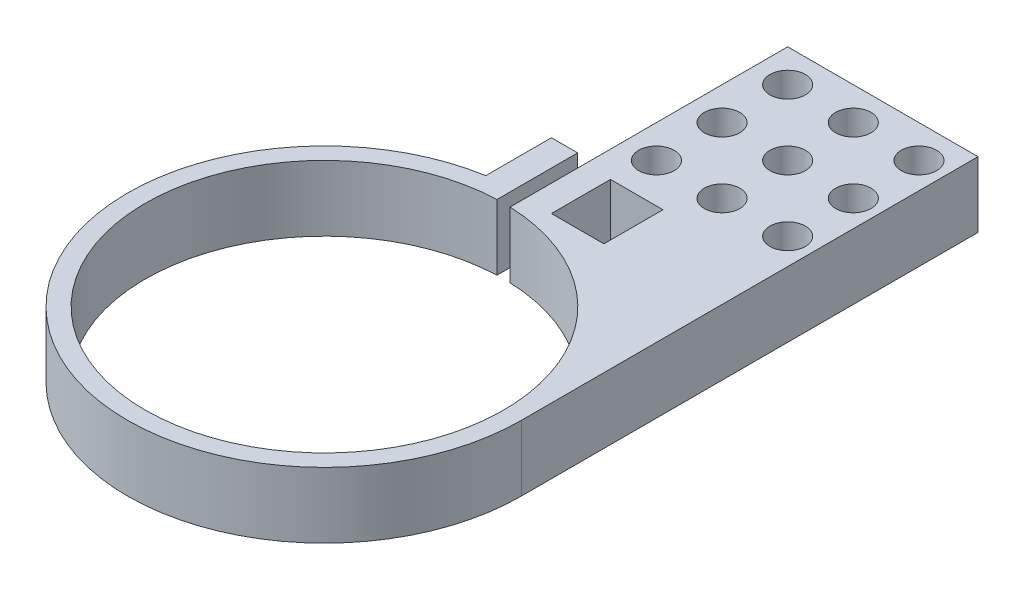
ISO-10303-21;
HEADER;
FILE_DESCRIPTION(('STEP AP214'),'2;1');
FILE_NAME('part.step','',(''),(''),'','','');
FILE_SCHEMA(('AUTOMOTIVE_DESIGN { 1 0 10303 214 1 1 1 1 }'));
ENDSEC;
DATA;
#1=APPLICATION_CONTEXT('core data for automotive mechanical design processes');
#2=APPLICATION_PROTOCOL_DEFINITION('international standard','automotive_design',2000,#1);
#3=PRODUCT_CONTEXT('',#1,'mechanical');
#4=PRODUCT('Part','Part','',(#3));
#5=PRODUCT_RELATED_PRODUCT_CATEGORY('part','',(#4));
#6=PRODUCT_DEFINITION_FORMATION('','',#4);
#7=PRODUCT_DEFINITION_CONTEXT('part definition',#1,'design');
#8=PRODUCT_DEFINITION('design','',#6,#7);
#9=PRODUCT_DEFINITION_SHAPE('','',#8);
#10=(LENGTH_UNIT() NAMED_UNIT(*) SI_UNIT(.MILLI.,.METRE.));
#11=(NAMED_UNIT(*) PLANE_ANGLE_UNIT() SI_UNIT($,.RADIAN.));
#12=(NAMED_UNIT(*) SI_UNIT($,.STERADIAN.) SOLID_ANGLE_UNIT());
#13=UNCERTAINTY_MEASURE_WITH_UNIT(LENGTH_MEASURE(1.E-05),#10,'distance_accuracy_value','');
#14=(GEOMETRIC_REPRESENTATION_CONTEXT(3) GLOBAL_UNCERTAINTY_ASSIGNED_CONTEXT((#13)) GLOBAL_UNIT_ASSIGNED_CONTEXT((#10,
#11,#12)) REPRESENTATION_CONTEXT('',''));
#15=CARTESIAN_POINT('',(0.,0.,0.));
#16=DIRECTION('',(0.,0.,1.));
#17=DIRECTION('',(1.,0.,0.));
#18=AXIS2_PLACEMENT_3D('',#15,#16,#17);
#19=CARTESIAN_POINT('',(0.,12.7,0.));
#20=DIRECTION('',(0.,-1.,0.));
#21=DIRECTION('',(0.,0.,-1.));
#22=AXIS2_PLACEMENT_3D('',#19,#20,#21);
#23=CYLINDRICAL_SURFACE('',#22,38.1);
#24=DIRECTION('',(0.,-1.,0.));
#25=VECTOR('',#24,1.);
#26=CARTESIAN_POINT('',(38.1,12.7,0.));
#27=LINE('',#26,#25);
#28=CARTESIAN_POINT('',(38.1,12.7,0.));
#29=VERTEX_POINT('',#28);
#30=CARTESIAN_POINT('',(38.1,0.,0.));
#31=VERTEX_POINT('',#30);
#32=EDGE_CURVE('E150',#29,#31,#27,.T.);
#33=ORIENTED_EDGE('',*,*,#32,.F.);
#34=CARTESIAN_POINT('',(0.,12.7,0.));
#35=DIRECTION('',(0.,1.,0.));
#36=DIRECTION('',(0.,0.,1.));
#37=AXIS2_PLACEMENT_3D('',#34,#35,#36);
#38=CIRCLE('',#37,38.1);
#39=CARTESIAN_POINT('',(-6.35000000000001,12.7,-37.5671066226826));
#40=VERTEX_POINT('',#39);
#41=EDGE_CURVE('E45',#40,#29,#38,.T.);
#42=ORIENTED_EDGE('',*,*,#41,.F.);
#43=DIRECTION('',(0.,-1.,0.));
#44=VECTOR('',#43,1.);
#45=CARTESIAN_POINT('',(-6.35,12.7,-37.5671066226826));
#46=LINE('',#45,#44);
#47=CARTESIAN_POINT('',(-6.35,0.,-37.5671066226826));
#48=VERTEX_POINT('',#47);
#49=EDGE_CURVE('E197',#40,#48,#46,.T.);
#50=ORIENTED_EDGE('',*,*,#49,.T.);
#51=CARTESIAN_POINT('',(0.,0.,0.));
#52=DIRECTION('',(0.,1.,0.));
#53=DIRECTION('',(0.,0.,1.));
#54=AXIS2_PLACEMENT_3D('',#51,#52,#53);
#55=CIRCLE('',#54,38.1);
#56=EDGE_CURVE('E184',#48,#31,#55,.T.);
#57=ORIENTED_EDGE('',*,*,#56,.T.);
#58=EDGE_LOOP('',(#33,#42,#50,#57));
#59=FACE_BOUND('',#58,.T.);
#60=ADVANCED_FACE('F38',(#59),#23,.T.);
#61=CARTESIAN_POINT('',(0.,12.7,0.));
#62=DIRECTION('',(0.,1.,0.));
#63=DIRECTION('',(0.,0.,1.));
#64=AXIS2_PLACEMENT_3D('',#61,#62,#63);
#65=PLANE('',#64);
#66=DIRECTION('',(1.,0.,0.));
#67=VECTOR('',#66,1.);
#68=CARTESIAN_POINT('',(1.27,12.7,-88.3671066226826));
#69=LINE('',#68,#67);
#70=CARTESIAN_POINT('',(1.27,12.7,-88.3671066226826));
#71=VERTEX_POINT('',#70);
#72=CARTESIAN_POINT('',(38.1,12.7,-88.3671066226826));
#73=VERTEX_POINT('',#72);
#74=EDGE_CURVE('E52',#71,#73,#69,.T.);
#75=ORIENTED_EDGE('',*,*,#74,.F.);
#76=DIRECTION('',(0.,0.,-1.));
#77=VECTOR('',#76,1.);
#78=CARTESIAN_POINT('',(1.27,12.7,-1.43164468337886));
#79=LINE('',#78,#77);
#80=CARTESIAN_POINT('',(1.27,12.7,-34.6477321191445));
#81=VERTEX_POINT('',#80);
#82=EDGE_CURVE('E139',#81,#71,#79,.T.);
#83=ORIENTED_EDGE('',*,*,#82,.F.);
#84=CARTESIAN_POINT('',(0.,12.7,0.));
#85=DIRECTION('',(0.,1.,0.));
#86=DIRECTION('',(0.,0.,1.));
#87=AXIS2_PLACEMENT_3D('',#84,#85,#86);
#88=CIRCLE('',#87,34.671);
#89=CARTESIAN_POINT('',(-1.27,12.7,-34.6477321191445));
#90=VERTEX_POINT('',#89);
#91=EDGE_CURVE('E187',#90,#81,#88,.T.);
#92=ORIENTED_EDGE('',*,*,#91,.F.);
#93=DIRECTION('',(0.,0.,1.));
#94=VECTOR('',#93,1.);
#95=CARTESIAN_POINT('',(-1.27,12.7,-1.43164468337886));
#96=LINE('',#95,#94);
#97=CARTESIAN_POINT('',(-1.27,12.7,-50.2671066226826));
#98=VERTEX_POINT('',#97);
#99=EDGE_CURVE('E153',#98,#90,#96,.T.);
#100=ORIENTED_EDGE('',*,*,#99,.F.);
#101=DIRECTION('',(-1.,0.,0.));
#102=VECTOR('',#101,1.);
#103=CARTESIAN_POINT('',(6.35,12.7,-50.2671066226826));
#104=LINE('',#103,#102);
#105=CARTESIAN_POINT('',(-6.35,12.7,-50.2671066226826));
#106=VERTEX_POINT('',#105);
#107=EDGE_CURVE('E168',#98,#106,#104,.T.);
#108=ORIENTED_EDGE('',*,*,#107,.T.);
#109=DIRECTION('',(0.,0.,1.));
#110=VECTOR('',#109,1.);
#111=CARTESIAN_POINT('',(-6.35,12.7,-50.2671066226826));
#112=LINE('',#111,#110);
#113=EDGE_CURVE('E163',#106,#40,#112,.T.);
#114=ORIENTED_EDGE('',*,*,#113,.T.);
#115=ORIENTED_EDGE('',*,*,#41,.T.);
#116=DIRECTION('',(0.,0.,1.));
#117=VECTOR('',#116,1.);
#118=CARTESIAN_POINT('',(38.1,12.7,-50.2671066226826));
#119=LINE('',#118,#117);
#120=EDGE_CURVE('E207',#73,#29,#119,.T.);
#121=ORIENTED_EDGE('',*,*,#120,.F.);
#122=EDGE_LOOP('',(#75,#83,#92,#100,#108,#114,#115,#121));
#123=FACE_BOUND('',#122,.T.);
#124=CARTESIAN_POINT('',(33.0200000000004,12.7,-56.6171066226826));
#125=DIRECTION('',(0.,1.,0.));
#126=DIRECTION('',(0.,0.,1.));
#127=AXIS2_PLACEMENT_3D('',#124,#125,#126);
#128=CIRCLE('',#127,3.42900000000001);
#129=CARTESIAN_POINT('',(33.0200000000004,12.7,-53.1881066226826));
#130=VERTEX_POINT('',#129);
#131=EDGE_CURVE('E215',#130,#130,#128,.T.);
#132=ORIENTED_EDGE('',*,*,#131,.F.);
#133=EDGE_LOOP('',(#132));
#134=FACE_BOUND('',#133,.T.);
#135=CARTESIAN_POINT('',(33.0200000000003,12.7,-69.3171066226826));
#136=DIRECTION('',(0.,1.,0.));
#137=DIRECTION('',(0.,0.,1.));
#138=AXIS2_PLACEMENT_3D('',#135,#136,#137);
#139=CIRCLE('',#138,3.42900000000001);
#140=CARTESIAN_POINT('',(33.0200000000003,12.7,-65.8881066226826));
#141=VERTEX_POINT('',#140);
#142=EDGE_CURVE('E226',#141,#141,#139,.T.);
#143=ORIENTED_EDGE('',*,*,#142,.F.);
#144=EDGE_LOOP('',(#143));
#145=FACE_BOUND('',#144,.T.);
#146=CARTESIAN_POINT('',(33.0200000000001,12.7,-82.0171066226826));
#147=DIRECTION('',(0.,1.,0.));
#148=DIRECTION('',(0.,0.,1.));
#149=AXIS2_PLACEMENT_3D('',#146,#147,#148);
#150=CIRCLE('',#149,3.42900000000001);
#151=CARTESIAN_POINT('',(33.0200000000001,12.7,-78.5881066226825));
#152=VERTEX_POINT('',#151);
#153=EDGE_CURVE('E233',#152,#152,#150,.T.);
#154=ORIENTED_EDGE('',*,*,#153,.F.);
#155=EDGE_LOOP('',(#154));
#156=FACE_BOUND('',#155,.T.);
#157=CARTESIAN_POINT('',(7.62000000000013,12.7,-82.0171066226826));
#158=DIRECTION('',(0.,1.,0.));
#159=DIRECTION('',(0.,0.,1.));
#160=AXIS2_PLACEMENT_3D('',#157,#158,#159);
#161=CIRCLE('',#160,3.42900000000001);
#162=CARTESIAN_POINT('',(7.62000000000013,12.7,-78.5881066226826));
#163=VERTEX_POINT('',#162);
#164=EDGE_CURVE('E322',#163,#163,#161,.T.);
#165=ORIENTED_EDGE('',*,*,#164,.F.);
#166=EDGE_LOOP('',(#165));
#167=FACE_BOUND('',#166,.T.);
#168=CARTESIAN_POINT('',(20.3200000000001,12.7,-82.0171066226826));
#169=DIRECTION('',(0.,1.,0.));
#170=DIRECTION('',(0.,0.,1.));
#171=AXIS2_PLACEMENT_3D('',#168,#169,#170);
#172=CIRCLE('',#171,3.42900000000001);
#173=CARTESIAN_POINT('',(20.3200000000001,12.7,-78.5881066226825));
#174=VERTEX_POINT('',#173);
#175=EDGE_CURVE('E261',#174,#174,#172,.T.);
#176=ORIENTED_EDGE('',*,*,#175,.F.);
#177=EDGE_LOOP('',(#176));
#178=FACE_BOUND('',#177,.T.);
#179=DIRECTION('',(1.,0.,0.));
#180=VECTOR('',#179,1.);
#181=CARTESIAN_POINT('',(6.35,12.7,-37.5671066226826));
#182=LINE('',#181,#180);
#183=CARTESIAN_POINT('',(6.35,12.7,-37.5671066226826));
#184=VERTEX_POINT('',#183);
#185=CARTESIAN_POINT('',(16.51,12.7,-37.5671066226826));
#186=VERTEX_POINT('',#185);
#187=EDGE_CURVE('E315',#184,#186,#182,.T.);
#188=ORIENTED_EDGE('',*,*,#187,.F.);
#189=DIRECTION('',(0.,0.,1.));
#190=VECTOR('',#189,1.);
#191=CARTESIAN_POINT('',(6.35,12.7,-48.9971066226826));
#192=LINE('',#191,#190);
#193=CARTESIAN_POINT('',(6.35,12.7,-48.9971066226826));
#194=VERTEX_POINT('',#193);
#195=EDGE_CURVE('E251',#194,#184,#192,.T.);
#196=ORIENTED_EDGE('',*,*,#195,.F.);
#197=DIRECTION('',(-1.,0.,0.));
#198=VECTOR('',#197,1.);
#199=CARTESIAN_POINT('',(6.35,12.7,-48.9971066226826));
#200=LINE('',#199,#198);
#201=CARTESIAN_POINT('',(16.51,12.7,-48.9971066226826));
#202=VERTEX_POINT('',#201);
#203=EDGE_CURVE('E247',#202,#194,#200,.T.);
#204=ORIENTED_EDGE('',*,*,#203,.F.);
#205=DIRECTION('',(0.,0.,-1.));
#206=VECTOR('',#205,1.);
#207=CARTESIAN_POINT('',(16.51,12.7,-48.9971066226826));
#208=LINE('',#207,#206);
#209=EDGE_CURVE('E265',#186,#202,#208,.T.);
#210=ORIENTED_EDGE('',*,*,#209,.F.);
#211=EDGE_LOOP('',(#188,#196,#204,#210));
#212=FACE_BOUND('',#211,.T.);
#213=CARTESIAN_POINT('',(7.62000000000027,12.7,-69.3171066226826));
#214=DIRECTION('',(0.,1.,0.));
#215=DIRECTION('',(0.,0.,1.));
#216=AXIS2_PLACEMENT_3D('',#213,#214,#215);
#217=CIRCLE('',#216,3.42900000000001);
#218=CARTESIAN_POINT('',(7.62000000000027,12.7,-65.8881066226825));
#219=VERTEX_POINT('',#218);
#220=EDGE_CURVE('E277',#219,#219,#217,.T.);
#221=ORIENTED_EDGE('',*,*,#220,.F.);
#222=EDGE_LOOP('',(#221));
#223=FACE_BOUND('',#222,.T.);
#224=CARTESIAN_POINT('',(20.3200000000003,12.7,-69.3171066226826));
#225=DIRECTION('',(0.,1.,0.));
#226=DIRECTION('',(0.,0.,1.));
#227=AXIS2_PLACEMENT_3D('',#224,#225,#226);
#228=CIRCLE('',#227,3.42900000000001);
#229=CARTESIAN_POINT('',(20.3200000000003,12.7,-65.8881066226825));
#230=VERTEX_POINT('',#229);
#231=EDGE_CURVE('E286',#230,#230,#228,.T.);
#232=ORIENTED_EDGE('',*,*,#231,.F.);
#233=EDGE_LOOP('',(#232));
#234=FACE_BOUND('',#233,.T.);
#235=CARTESIAN_POINT('',(7.6200000000004,12.7,-56.6171066226826));
#236=DIRECTION('',(0.,1.,0.));
#237=DIRECTION('',(0.,0.,1.));
#238=AXIS2_PLACEMENT_3D('',#235,#236,#237);
#239=CIRCLE('',#238,3.42900000000001);
#240=CARTESIAN_POINT('',(7.6200000000004,12.7,-53.1881066226826));
#241=VERTEX_POINT('',#240);
#242=EDGE_CURVE('E294',#241,#241,#239,.T.);
#243=ORIENTED_EDGE('',*,*,#242,.F.);
#244=EDGE_LOOP('',(#243));
#245=FACE_BOUND('',#244,.T.);
#246=CARTESIAN_POINT('',(20.3200000000004,12.7,-56.6171066226826));
#247=DIRECTION('',(0.,1.,0.));
#248=DIRECTION('',(0.,0.,1.));
#249=AXIS2_PLACEMENT_3D('',#246,#247,#248);
#250=CIRCLE('',#249,3.42900000000002);
#251=CARTESIAN_POINT('',(20.3200000000004,12.7,-53.1881066226826));
#252=VERTEX_POINT('',#251);
#253=EDGE_CURVE('E301',#252,#252,#250,.T.);
#254=ORIENTED_EDGE('',*,*,#253,.F.);
#255=EDGE_LOOP('',(#254));
#256=FACE_BOUND('',#255,.T.);
#257=ADVANCED_FACE('F349',(#123,#134,#145,#156,#167,#178,#212,#223,#234,#245,#256),#65,.T.);
#258=CARTESIAN_POINT('',(0.,0.,0.));
#259=DIRECTION('',(0.,1.,0.));
#260=DIRECTION('',(0.,0.,1.));
#261=AXIS2_PLACEMENT_3D('',#258,#259,#260);
#262=PLANE('',#261);
#263=CARTESIAN_POINT('',(33.0200000000004,0.,-56.6171066226826));
#264=DIRECTION('',(0.,1.,0.));
#265=DIRECTION('',(0.,0.,1.));
#266=AXIS2_PLACEMENT_3D('',#263,#264,#265);
#267=CIRCLE('',#266,3.42900000000001);
#268=CARTESIAN_POINT('',(33.0200000000004,0.,-53.1881066226826));
#269=VERTEX_POINT('',#268);
#270=EDGE_CURVE('E212',#269,#269,#267,.T.);
#271=ORIENTED_EDGE('',*,*,#270,.T.);
#272=EDGE_LOOP('',(#271));
#273=FACE_BOUND('',#272,.T.);
#274=CARTESIAN_POINT('',(33.0200000000003,0.,-69.3171066226826));
#275=DIRECTION('',(0.,1.,0.));
#276=DIRECTION('',(0.,0.,1.));
#277=AXIS2_PLACEMENT_3D('',#274,#275,#276);
#278=CIRCLE('',#277,3.42900000000001);
#279=CARTESIAN_POINT('',(33.0200000000003,0.,-65.8881066226826));
#280=VERTEX_POINT('',#279);
#281=EDGE_CURVE('E220',#280,#280,#278,.T.);
#282=ORIENTED_EDGE('',*,*,#281,.T.);
#283=EDGE_LOOP('',(#282));
#284=FACE_BOUND('',#283,.T.);
#285=CARTESIAN_POINT('',(33.0200000000001,0.,-82.0171066226826));
#286=DIRECTION('',(0.,1.,0.));
#287=DIRECTION('',(0.,0.,1.));
#288=AXIS2_PLACEMENT_3D('',#285,#286,#287);
#289=CIRCLE('',#288,3.42900000000001);
#290=CARTESIAN_POINT('',(33.0200000000001,0.,-78.5881066226825));
#291=VERTEX_POINT('',#290);
#292=EDGE_CURVE('E231',#291,#291,#289,.T.);
#293=ORIENTED_EDGE('',*,*,#292,.T.);
#294=EDGE_LOOP('',(#293));
#295=FACE_BOUND('',#294,.T.);
#296=CARTESIAN_POINT('',(7.62000000000013,0.,-82.0171066226826));
#297=DIRECTION('',(0.,1.,0.));
#298=DIRECTION('',(0.,0.,1.));
#299=AXIS2_PLACEMENT_3D('',#296,#297,#298);
#300=CIRCLE('',#299,3.42900000000001);
#301=CARTESIAN_POINT('',(7.62000000000013,0.,-78.5881066226826));
#302=VERTEX_POINT('',#301);
#303=EDGE_CURVE('E282',#302,#302,#300,.T.);
#304=ORIENTED_EDGE('',*,*,#303,.T.);
#305=EDGE_LOOP('',(#304));
#306=FACE_BOUND('',#305,.T.);
#307=CARTESIAN_POINT('',(20.3200000000001,0.,-82.0171066226826));
#308=DIRECTION('',(0.,1.,0.));
#309=DIRECTION('',(0.,0.,1.));
#310=AXIS2_PLACEMENT_3D('',#307,#308,#309);
#311=CIRCLE('',#310,3.42900000000001);
#312=CARTESIAN_POINT('',(20.3200000000001,0.,-78.5881066226825));
#313=VERTEX_POINT('',#312);
#314=EDGE_CURVE('E312',#313,#313,#311,.T.);
#315=ORIENTED_EDGE('',*,*,#314,.T.);
#316=EDGE_LOOP('',(#315));
#317=FACE_BOUND('',#316,.T.);
#318=DIRECTION('',(0.,0.,1.));
#319=VECTOR('',#318,1.);
#320=CARTESIAN_POINT('',(6.35,0.,-48.9971066226826));
#321=LINE('',#320,#319);
#322=CARTESIAN_POINT('',(6.35,0.,-48.9971066226826));
#323=VERTEX_POINT('',#322);
#324=CARTESIAN_POINT('',(6.35,0.,-37.5671066226826));
#325=VERTEX_POINT('',#324);
#326=EDGE_CURVE('E258',#323,#325,#321,.T.);
#327=ORIENTED_EDGE('',*,*,#326,.T.);
#328=DIRECTION('',(1.,0.,0.));
#329=VECTOR('',#328,1.);
#330=CARTESIAN_POINT('',(6.35,0.,-37.5671066226826));
#331=LINE('',#330,#329);
#332=CARTESIAN_POINT('',(16.51,0.,-37.5671066226826));
#333=VERTEX_POINT('',#332);
#334=EDGE_CURVE('E255',#325,#333,#331,.T.);
#335=ORIENTED_EDGE('',*,*,#334,.T.);
#336=DIRECTION('',(0.,0.,-1.));
#337=VECTOR('',#336,1.);
#338=CARTESIAN_POINT('',(16.51,0.,-48.9971066226826));
#339=LINE('',#338,#337);
#340=CARTESIAN_POINT('',(16.51,0.,-48.9971066226826));
#341=VERTEX_POINT('',#340);
#342=EDGE_CURVE('E252',#333,#341,#339,.T.);
#343=ORIENTED_EDGE('',*,*,#342,.T.);
#344=DIRECTION('',(-1.,0.,0.));
#345=VECTOR('',#344,1.);
#346=CARTESIAN_POINT('',(6.35,0.,-48.9971066226826));
#347=LINE('',#346,#345);
#348=EDGE_CURVE('E248',#341,#323,#347,.T.);
#349=ORIENTED_EDGE('',*,*,#348,.T.);
#350=EDGE_LOOP('',(#327,#335,#343,#349));
#351=FACE_BOUND('',#350,.T.);
#352=CARTESIAN_POINT('',(7.62000000000027,0.,-69.3171066226826));
#353=DIRECTION('',(0.,1.,0.));
#354=DIRECTION('',(0.,0.,1.));
#355=AXIS2_PLACEMENT_3D('',#352,#353,#354);
#356=CIRCLE('',#355,3.42900000000001);
#357=CARTESIAN_POINT('',(7.62000000000027,0.,-65.8881066226825));
#358=VERTEX_POINT('',#357);
#359=EDGE_CURVE('E283',#358,#358,#356,.T.);
#360=ORIENTED_EDGE('',*,*,#359,.T.);
#361=EDGE_LOOP('',(#360));
#362=FACE_BOUND('',#361,.T.);
#363=CARTESIAN_POINT('',(20.3200000000003,0.,-69.3171066226826));
#364=DIRECTION('',(0.,1.,0.));
#365=DIRECTION('',(0.,0.,1.));
#366=AXIS2_PLACEMENT_3D('',#363,#364,#365);
#367=CIRCLE('',#366,3.42900000000001);
#368=CARTESIAN_POINT('',(20.3200000000003,0.,-65.8881066226825));
#369=VERTEX_POINT('',#368);
#370=EDGE_CURVE('E291',#369,#369,#367,.T.);
#371=ORIENTED_EDGE('',*,*,#370,.T.);
#372=EDGE_LOOP('',(#371));
#373=FACE_BOUND('',#372,.T.);
#374=CARTESIAN_POINT('',(7.6200000000004,0.,-56.6171066226826));
#375=DIRECTION('',(0.,1.,0.));
#376=DIRECTION('',(0.,0.,1.));
#377=AXIS2_PLACEMENT_3D('',#374,#375,#376);
#378=CIRCLE('',#377,3.42900000000001);
#379=CARTESIAN_POINT('',(7.6200000000004,0.,-53.1881066226826));
#380=VERTEX_POINT('',#379);
#381=EDGE_CURVE('E299',#380,#380,#378,.T.);
#382=ORIENTED_EDGE('',*,*,#381,.T.);
#383=EDGE_LOOP('',(#382));
#384=FACE_BOUND('',#383,.T.);
#385=CARTESIAN_POINT('',(20.3200000000004,0.,-56.6171066226826));
#386=DIRECTION('',(0.,1.,0.));
#387=DIRECTION('',(0.,0.,1.));
#388=AXIS2_PLACEMENT_3D('',#385,#386,#387);
#389=CIRCLE('',#388,3.42900000000002);
#390=CARTESIAN_POINT('',(20.3200000000004,0.,-53.1881066226826));
#391=VERTEX_POINT('',#390);
#392=EDGE_CURVE('E238',#391,#391,#389,.T.);
#393=ORIENTED_EDGE('',*,*,#392,.T.);
#394=EDGE_LOOP('',(#393));
#395=FACE_BOUND('',#394,.T.);
#396=DIRECTION('',(0.,0.,-1.));
#397=VECTOR('',#396,1.);
#398=CARTESIAN_POINT('',(1.27,0.,-1.43164468337886));
#399=LINE('',#398,#397);
#400=CARTESIAN_POINT('',(1.27,0.,-34.6477321191445));
#401=VERTEX_POINT('',#400);
#402=CARTESIAN_POINT('',(1.27,0.,-88.3671066226826));
#403=VERTEX_POINT('',#402);
#404=EDGE_CURVE('E136',#401,#403,#399,.T.);
#405=ORIENTED_EDGE('',*,*,#404,.T.);
#406=DIRECTION('',(1.,0.,0.));
#407=VECTOR('',#406,1.);
#408=CARTESIAN_POINT('',(1.27,0.,-88.3671066226826));
#409=LINE('',#408,#407);
#410=CARTESIAN_POINT('',(38.1,0.,-88.3671066226826));
#411=VERTEX_POINT('',#410);
#412=EDGE_CURVE('E123',#403,#411,#409,.T.);
#413=ORIENTED_EDGE('',*,*,#412,.T.);
#414=DIRECTION('',(0.,0.,-1.));
#415=VECTOR('',#414,1.);
#416=CARTESIAN_POINT('',(38.1,0.,-50.2671066226826));
#417=LINE('',#416,#415);
#418=EDGE_CURVE('E147',#31,#411,#417,.T.);
#419=ORIENTED_EDGE('',*,*,#418,.F.);
#420=ORIENTED_EDGE('',*,*,#56,.F.);
#421=DIRECTION('',(0.,0.,1.));
#422=VECTOR('',#421,1.);
#423=CARTESIAN_POINT('',(-6.35,0.,-50.2671066226826));
#424=LINE('',#423,#422);
#425=CARTESIAN_POINT('',(-6.35,0.,-50.2671066226826));
#426=VERTEX_POINT('',#425);
#427=EDGE_CURVE('E162',#426,#48,#424,.T.);
#428=ORIENTED_EDGE('',*,*,#427,.F.);
#429=DIRECTION('',(-1.,0.,0.));
#430=VECTOR('',#429,1.);
#431=CARTESIAN_POINT('',(6.35,0.,-50.2671066226826));
#432=LINE('',#431,#430);
#433=CARTESIAN_POINT('',(-1.27,0.,-50.2671066226826));
#434=VERTEX_POINT('',#433);
#435=EDGE_CURVE('E169',#434,#426,#432,.T.);
#436=ORIENTED_EDGE('',*,*,#435,.F.);
#437=DIRECTION('',(0.,0.,1.));
#438=VECTOR('',#437,1.);
#439=CARTESIAN_POINT('',(-1.27,0.,-1.43164468337886));
#440=LINE('',#439,#438);
#441=CARTESIAN_POINT('',(-1.27,0.,-34.6477321191445));
#442=VERTEX_POINT('',#441);
#443=EDGE_CURVE('E146',#434,#442,#440,.T.);
#444=ORIENTED_EDGE('',*,*,#443,.T.);
#445=CARTESIAN_POINT('',(0.,0.,0.));
#446=DIRECTION('',(0.,1.,0.));
#447=DIRECTION('',(0.,0.,1.));
#448=AXIS2_PLACEMENT_3D('',#445,#446,#447);
#449=CIRCLE('',#448,34.671);
#450=EDGE_CURVE('E145',#442,#401,#449,.T.);
#451=ORIENTED_EDGE('',*,*,#450,.T.);
#452=EDGE_LOOP('',(#405,#413,#419,#420,#428,#436,#444,#451));
#453=FACE_BOUND('',#452,.T.);
#454=ADVANCED_FACE('F142',(#273,#284,#295,#306,#317,#351,#362,#373,#384,#395,#453),#262,.F.);
#455=CARTESIAN_POINT('',(0.,12.7,0.));
#456=DIRECTION('',(0.,-1.,0.));
#457=DIRECTION('',(0.,0.,-1.));
#458=AXIS2_PLACEMENT_3D('',#455,#456,#457);
#459=CYLINDRICAL_SURFACE('',#458,34.671);
#460=ORIENTED_EDGE('',*,*,#91,.T.);
#461=DIRECTION('',(0.,-1.,0.));
#462=VECTOR('',#461,1.);
#463=CARTESIAN_POINT('',(1.27,12.7,-34.6477321191445));
#464=LINE('',#463,#462);
#465=EDGE_CURVE('E160',#81,#401,#464,.T.);
#466=ORIENTED_EDGE('',*,*,#465,.T.);
#467=ORIENTED_EDGE('',*,*,#450,.F.);
#468=DIRECTION('',(0.,-1.,0.));
#469=VECTOR('',#468,1.);
#470=CARTESIAN_POINT('',(-1.27,12.7,-34.6477321191445));
#471=LINE('',#470,#469);
#472=EDGE_CURVE('E157',#442,#90,#471,.F.);
#473=ORIENTED_EDGE('',*,*,#472,.T.);
#474=EDGE_LOOP('',(#460,#466,#467,#473));
#475=FACE_BOUND('',#474,.T.);
#476=ADVANCED_FACE('F398',(#475),#459,.F.);
#477=CARTESIAN_POINT('',(6.35,12.7,-50.2671066226826));
#478=DIRECTION('',(0.,0.,1.));
#479=DIRECTION('',(1.,0.,0.));
#480=AXIS2_PLACEMENT_3D('',#477,#478,#479);
#481=PLANE('',#480);
#482=DIRECTION('',(0.,1.,0.));
#483=VECTOR('',#482,1.);
#484=CARTESIAN_POINT('',(-1.27,12.7,-50.2671066226826));
#485=LINE('',#484,#483);
#486=EDGE_CURVE('E12',#434,#98,#485,.T.);
#487=ORIENTED_EDGE('',*,*,#486,.F.);
#488=ORIENTED_EDGE('',*,*,#435,.T.);
#489=DIRECTION('',(0.,-1.,0.));
#490=VECTOR('',#489,1.);
#491=CARTESIAN_POINT('',(-6.35,12.7,-50.2671066226826));
#492=LINE('',#491,#490);
#493=EDGE_CURVE('E368',#106,#426,#492,.T.);
#494=ORIENTED_EDGE('',*,*,#493,.F.);
#495=ORIENTED_EDGE('',*,*,#107,.F.);
#496=EDGE_LOOP('',(#487,#488,#494,#495));
#497=FACE_BOUND('',#496,.T.);
#498=ADVANCED_FACE('F374',(#497),#481,.F.);
#499=CARTESIAN_POINT('',(-6.35,12.7,-50.2671066226826));
#500=DIRECTION('',(1.,0.,0.));
#501=DIRECTION('',(0.,0.,-1.));
#502=AXIS2_PLACEMENT_3D('',#499,#500,#501);
#503=PLANE('',#502);
#504=ORIENTED_EDGE('',*,*,#427,.T.);
#505=ORIENTED_EDGE('',*,*,#49,.F.);
#506=ORIENTED_EDGE('',*,*,#113,.F.);
#507=ORIENTED_EDGE('',*,*,#493,.T.);
#508=EDGE_LOOP('',(#504,#505,#506,#507));
#509=FACE_BOUND('',#508,.T.);
#510=ADVANCED_FACE('F366',(#509),#503,.F.);
#511=CARTESIAN_POINT('',(-1.27,12.7,-1.43164468337886));
#512=DIRECTION('',(1.,0.,0.));
#513=DIRECTION('',(0.,0.,-1.));
#514=AXIS2_PLACEMENT_3D('',#511,#512,#513);
#515=PLANE('',#514);
#516=ORIENTED_EDGE('',*,*,#443,.F.);
#517=ORIENTED_EDGE('',*,*,#486,.T.);
#518=ORIENTED_EDGE('',*,*,#99,.T.);
#519=ORIENTED_EDGE('',*,*,#472,.F.);
#520=EDGE_LOOP('',(#516,#517,#518,#519));
#521=FACE_BOUND('',#520,.T.);
#522=ADVANCED_FACE('F387',(#521),#515,.T.);
#523=CARTESIAN_POINT('',(1.27,12.7,-1.43164468337886));
#524=DIRECTION('',(-1.,0.,0.));
#525=DIRECTION('',(0.,0.,1.));
#526=AXIS2_PLACEMENT_3D('',#523,#524,#525);
#527=PLANE('',#526);
#528=DIRECTION('',(0.,1.,0.));
#529=VECTOR('',#528,1.);
#530=CARTESIAN_POINT('',(1.27,0.,-88.3671066226826));
#531=LINE('',#530,#529);
#532=EDGE_CURVE('E126',#403,#71,#531,.T.);
#533=ORIENTED_EDGE('',*,*,#532,.F.);
#534=ORIENTED_EDGE('',*,*,#404,.F.);
#535=ORIENTED_EDGE('',*,*,#465,.F.);
#536=ORIENTED_EDGE('',*,*,#82,.T.);
#537=EDGE_LOOP('',(#533,#534,#535,#536));
#538=FACE_BOUND('',#537,.T.);
#539=ADVANCED_FACE('F135',(#538),#527,.T.);
#540=CARTESIAN_POINT('',(38.1,0.,0.));
#541=DIRECTION('',(-1.,0.,0.));
#542=DIRECTION('',(0.,0.,1.));
#543=AXIS2_PLACEMENT_3D('',#540,#541,#542);
#544=PLANE('',#543);
#545=ORIENTED_EDGE('',*,*,#418,.T.);
#546=DIRECTION('',(0.,1.,0.));
#547=VECTOR('',#546,1.);
#548=CARTESIAN_POINT('',(38.1,0.,-88.3671066226826));
#549=LINE('',#548,#547);
#550=EDGE_CURVE('E127',#411,#73,#549,.T.);
#551=ORIENTED_EDGE('',*,*,#550,.T.);
#552=ORIENTED_EDGE('',*,*,#120,.T.);
#553=ORIENTED_EDGE('',*,*,#32,.T.);
#554=EDGE_LOOP('',(#545,#551,#552,#553));
#555=FACE_BOUND('',#554,.T.);
#556=ADVANCED_FACE('F375',(#555),#544,.F.);
#557=CARTESIAN_POINT('',(20.3200000000004,12.7,-56.6171066226826));
#558=DIRECTION('',(0.,-1.,0.));
#559=DIRECTION('',(0.,0.,-1.));
#560=AXIS2_PLACEMENT_3D('',#557,#558,#559);
#561=CYLINDRICAL_SURFACE('',#560,3.42900000000002);
#562=ORIENTED_EDGE('',*,*,#253,.T.);
#563=EDGE_LOOP('',(#562));
#564=FACE_BOUND('',#563,.T.);
#565=ORIENTED_EDGE('',*,*,#392,.F.);
#566=EDGE_LOOP('',(#565));
#567=FACE_BOUND('',#566,.T.);
#568=ADVANCED_FACE('F379',(#564,#567),#561,.F.);
#569=CARTESIAN_POINT('',(7.6200000000004,12.7,-56.6171066226826));
#570=DIRECTION('',(0.,-1.,0.));
#571=DIRECTION('',(0.,0.,-1.));
#572=AXIS2_PLACEMENT_3D('',#569,#570,#571);
#573=CYLINDRICAL_SURFACE('',#572,3.42900000000001);
#574=ORIENTED_EDGE('',*,*,#242,.T.);
#575=EDGE_LOOP('',(#574));
#576=FACE_BOUND('',#575,.T.);
#577=ORIENTED_EDGE('',*,*,#381,.F.);
#578=EDGE_LOOP('',(#577));
#579=FACE_BOUND('',#578,.T.);
#580=ADVANCED_FACE('F385',(#576,#579),#573,.F.);
#581=CARTESIAN_POINT('',(20.3200000000003,12.7,-69.3171066226826));
#582=DIRECTION('',(0.,-1.,0.));
#583=DIRECTION('',(0.,0.,-1.));
#584=AXIS2_PLACEMENT_3D('',#581,#582,#583);
#585=CYLINDRICAL_SURFACE('',#584,3.42900000000001);
#586=ORIENTED_EDGE('',*,*,#231,.T.);
#587=EDGE_LOOP('',(#586));
#588=FACE_BOUND('',#587,.T.);
#589=ORIENTED_EDGE('',*,*,#370,.F.);
#590=EDGE_LOOP('',(#589));
#591=FACE_BOUND('',#590,.T.);
#592=ADVANCED_FACE('F463',(#588,#591),#585,.F.);
#593=CARTESIAN_POINT('',(7.62000000000027,12.7,-69.3171066226826));
#594=DIRECTION('',(0.,-1.,0.));
#595=DIRECTION('',(0.,0.,-1.));
#596=AXIS2_PLACEMENT_3D('',#593,#594,#595);
#597=CYLINDRICAL_SURFACE('',#596,3.42900000000001);
#598=ORIENTED_EDGE('',*,*,#220,.T.);
#599=EDGE_LOOP('',(#598));
#600=FACE_BOUND('',#599,.T.);
#601=ORIENTED_EDGE('',*,*,#359,.F.);
#602=EDGE_LOOP('',(#601));
#603=FACE_BOUND('',#602,.T.);
#604=ADVANCED_FACE('F429',(#600,#603),#597,.F.);
#605=CARTESIAN_POINT('',(6.35,12.7,-48.9971066226826));
#606=DIRECTION('',(1.,0.,0.));
#607=DIRECTION('',(0.,0.,-1.));
#608=AXIS2_PLACEMENT_3D('',#605,#606,#607);
#609=PLANE('',#608);
#610=ORIENTED_EDGE('',*,*,#326,.F.);
#611=DIRECTION('',(0.,-1.,0.));
#612=VECTOR('',#611,1.);
#613=CARTESIAN_POINT('',(6.35,12.7,-48.9971066226826));
#614=LINE('',#613,#612);
#615=EDGE_CURVE('E244',#194,#323,#614,.T.);
#616=ORIENTED_EDGE('',*,*,#615,.F.);
#617=ORIENTED_EDGE('',*,*,#195,.T.);
#618=DIRECTION('',(0.,-1.,0.));
#619=VECTOR('',#618,1.);
#620=CARTESIAN_POINT('',(6.35,12.7,-37.5671066226826));
#621=LINE('',#620,#619);
#622=EDGE_CURVE('E210',#184,#325,#621,.T.);
#623=ORIENTED_EDGE('',*,*,#622,.T.);
#624=EDGE_LOOP('',(#610,#616,#617,#623));
#625=FACE_BOUND('',#624,.T.);
#626=ADVANCED_FACE('F425',(#625),#609,.T.);
#627=CARTESIAN_POINT('',(6.35,12.7,-37.5671066226826));
#628=DIRECTION('',(0.,0.,-1.));
#629=DIRECTION('',(-1.,0.,0.));
#630=AXIS2_PLACEMENT_3D('',#627,#628,#629);
#631=PLANE('',#630);
#632=ORIENTED_EDGE('',*,*,#334,.F.);
#633=ORIENTED_EDGE('',*,*,#622,.F.);
#634=ORIENTED_EDGE('',*,*,#187,.T.);
#635=DIRECTION('',(0.,-1.,0.));
#636=VECTOR('',#635,1.);
#637=CARTESIAN_POINT('',(16.51,12.7,-37.5671066226826));
#638=LINE('',#637,#636);
#639=EDGE_CURVE('E241',#186,#333,#638,.T.);
#640=ORIENTED_EDGE('',*,*,#639,.T.);
#641=EDGE_LOOP('',(#632,#633,#634,#640));
#642=FACE_BOUND('',#641,.T.);
#643=ADVANCED_FACE('F428',(#642),#631,.T.);
#644=CARTESIAN_POINT('',(16.51,12.7,-48.9971066226826));
#645=DIRECTION('',(-1.,0.,0.));
#646=DIRECTION('',(0.,0.,1.));
#647=AXIS2_PLACEMENT_3D('',#644,#645,#646);
#648=PLANE('',#647);
#649=ORIENTED_EDGE('',*,*,#342,.F.);
#650=ORIENTED_EDGE('',*,*,#639,.F.);
#651=ORIENTED_EDGE('',*,*,#209,.T.);
#652=DIRECTION('',(0.,-1.,0.));
#653=VECTOR('',#652,1.);
#654=CARTESIAN_POINT('',(16.51,12.7,-48.9971066226826));
#655=LINE('',#654,#653);
#656=EDGE_CURVE('E60',#202,#341,#655,.T.);
#657=ORIENTED_EDGE('',*,*,#656,.T.);
#658=EDGE_LOOP('',(#649,#650,#651,#657));
#659=FACE_BOUND('',#658,.T.);
#660=ADVANCED_FACE('F345',(#659),#648,.T.);
#661=CARTESIAN_POINT('',(6.35,12.7,-48.9971066226826));
#662=DIRECTION('',(0.,0.,1.));
#663=DIRECTION('',(1.,0.,0.));
#664=AXIS2_PLACEMENT_3D('',#661,#662,#663);
#665=PLANE('',#664);
#666=ORIENTED_EDGE('',*,*,#348,.F.);
#667=ORIENTED_EDGE('',*,*,#656,.F.);
#668=ORIENTED_EDGE('',*,*,#203,.T.);
#669=ORIENTED_EDGE('',*,*,#615,.T.);
#670=EDGE_LOOP('',(#666,#667,#668,#669));
#671=FACE_BOUND('',#670,.T.);
#672=ADVANCED_FACE('F336',(#671),#665,.T.);
#673=CARTESIAN_POINT('',(20.3200000000001,12.7,-82.0171066226826));
#674=DIRECTION('',(0.,-1.,0.));
#675=DIRECTION('',(0.,0.,-1.));
#676=AXIS2_PLACEMENT_3D('',#673,#674,#675);
#677=CYLINDRICAL_SURFACE('',#676,3.42900000000001);
#678=ORIENTED_EDGE('',*,*,#175,.T.);
#679=EDGE_LOOP('',(#678));
#680=FACE_BOUND('',#679,.T.);
#681=ORIENTED_EDGE('',*,*,#314,.F.);
#682=EDGE_LOOP('',(#681));
#683=FACE_BOUND('',#682,.T.);
#684=ADVANCED_FACE('F333',(#680,#683),#677,.F.);
#685=CARTESIAN_POINT('',(7.62000000000013,12.7,-82.0171066226826));
#686=DIRECTION('',(0.,-1.,0.));
#687=DIRECTION('',(0.,0.,-1.));
#688=AXIS2_PLACEMENT_3D('',#685,#686,#687);
#689=CYLINDRICAL_SURFACE('',#688,3.42900000000001);
#690=ORIENTED_EDGE('',*,*,#164,.T.);
#691=EDGE_LOOP('',(#690));
#692=FACE_BOUND('',#691,.T.);
#693=ORIENTED_EDGE('',*,*,#303,.F.);
#694=EDGE_LOOP('',(#693));
#695=FACE_BOUND('',#694,.T.);
#696=ADVANCED_FACE('F335',(#692,#695),#689,.F.);
#697=CARTESIAN_POINT('',(33.0200000000001,12.7,-82.0171066226826));
#698=DIRECTION('',(0.,-1.,0.));
#699=DIRECTION('',(0.,0.,-1.));
#700=AXIS2_PLACEMENT_3D('',#697,#698,#699);
#701=CYLINDRICAL_SURFACE('',#700,3.42900000000001);
#702=ORIENTED_EDGE('',*,*,#153,.T.);
#703=EDGE_LOOP('',(#702));
#704=FACE_BOUND('',#703,.T.);
#705=ORIENTED_EDGE('',*,*,#292,.F.);
#706=EDGE_LOOP('',(#705));
#707=FACE_BOUND('',#706,.T.);
#708=ADVANCED_FACE('F343',(#704,#707),#701,.F.);
#709=CARTESIAN_POINT('',(33.0200000000003,12.7,-69.3171066226826));
#710=DIRECTION('',(0.,-1.,0.));
#711=DIRECTION('',(0.,0.,-1.));
#712=AXIS2_PLACEMENT_3D('',#709,#710,#711);
#713=CYLINDRICAL_SURFACE('',#712,3.42900000000001);
#714=ORIENTED_EDGE('',*,*,#142,.T.);
#715=EDGE_LOOP('',(#714));
#716=FACE_BOUND('',#715,.T.);
#717=ORIENTED_EDGE('',*,*,#281,.F.);
#718=EDGE_LOOP('',(#717));
#719=FACE_BOUND('',#718,.T.);
#720=ADVANCED_FACE('F417',(#716,#719),#713,.F.);
#721=CARTESIAN_POINT('',(33.0200000000004,12.7,-56.6171066226826));
#722=DIRECTION('',(0.,-1.,0.));
#723=DIRECTION('',(0.,0.,-1.));
#724=AXIS2_PLACEMENT_3D('',#721,#722,#723);
#725=CYLINDRICAL_SURFACE('',#724,3.42900000000001);
#726=ORIENTED_EDGE('',*,*,#131,.T.);
#727=EDGE_LOOP('',(#726));
#728=FACE_BOUND('',#727,.T.);
#729=ORIENTED_EDGE('',*,*,#270,.F.);
#730=EDGE_LOOP('',(#729));
#731=FACE_BOUND('',#730,.T.);
#732=ADVANCED_FACE('F391',(#728,#731),#725,.F.);
#733=CARTESIAN_POINT('',(1.27,0.,-88.3671066226826));
#734=DIRECTION('',(0.,0.,1.));
#735=DIRECTION('',(1.,0.,0.));
#736=AXIS2_PLACEMENT_3D('',#733,#734,#735);
#737=PLANE('',#736);
#738=ORIENTED_EDGE('',*,*,#74,.T.);
#739=ORIENTED_EDGE('',*,*,#550,.F.);
#740=ORIENTED_EDGE('',*,*,#412,.F.);
#741=ORIENTED_EDGE('',*,*,#532,.T.);
#742=EDGE_LOOP('',(#738,#739,#740,#741));
#743=FACE_BOUND('',#742,.T.);
#744=ADVANCED_FACE('F125',(#743),#737,.F.);
#745=CLOSED_SHELL('',(#60,#257,#454,#476,#498,#510,#522,#539,#556,#568,#580,#592,#604,#626,#643,
#660,#672,#684,#696,#708,#720,#732,#744));
#746=MANIFOLD_SOLID_BREP('B2',#745);
#747=ADVANCED_BREP_SHAPE_REPRESENTATION('',(#18,#746),#14);
#748=SHAPE_DEFINITION_REPRESENTATION(#9,#747);
ENDSEC;
END-ISO-10303-21;
